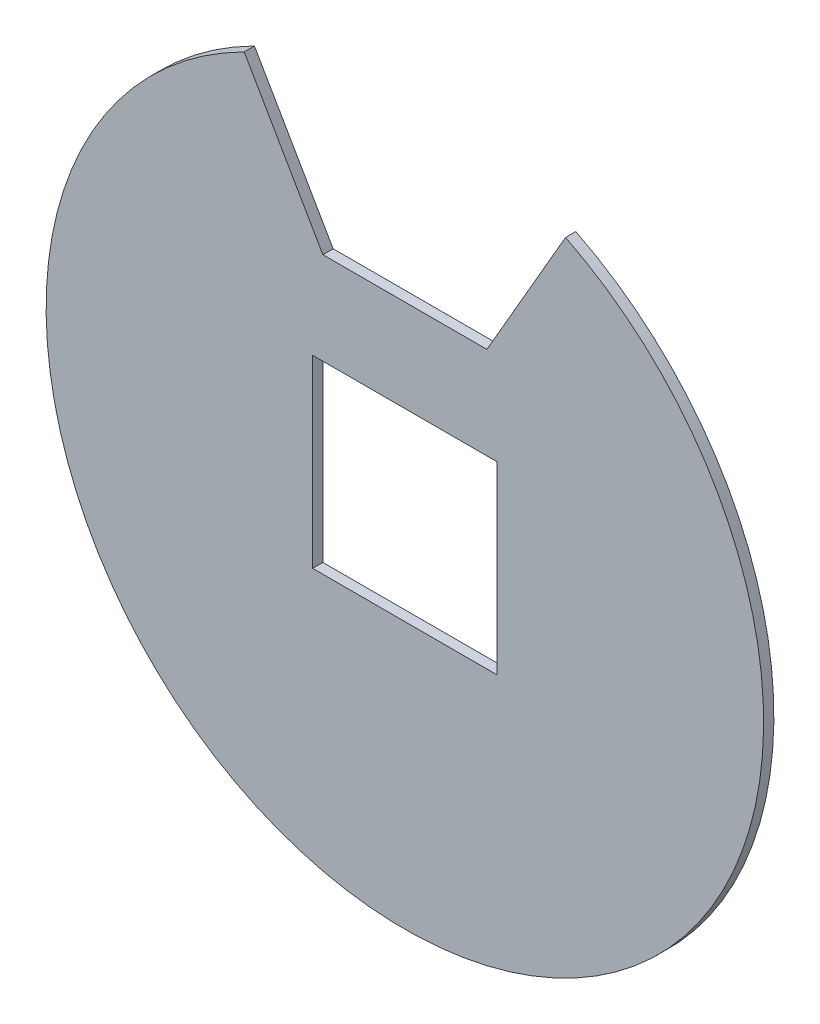
ISO-10303-21;
HEADER;
FILE_DESCRIPTION(('STEP AP214'),'2;1');
FILE_NAME('part.step','',(''),(''),'','','');
FILE_SCHEMA(('AUTOMOTIVE_DESIGN { 1 0 10303 214 1 1 1 1 }'));
ENDSEC;
DATA;
#1=APPLICATION_CONTEXT('core data for automotive mechanical design processes');
#2=APPLICATION_PROTOCOL_DEFINITION('international standard','automotive_design',2000,#1);
#3=PRODUCT_CONTEXT('',#1,'mechanical');
#4=PRODUCT('Part','Part','',(#3));
#5=PRODUCT_RELATED_PRODUCT_CATEGORY('part','',(#4));
#6=PRODUCT_DEFINITION_FORMATION('','',#4);
#7=PRODUCT_DEFINITION_CONTEXT('part definition',#1,'design');
#8=PRODUCT_DEFINITION('design','',#6,#7);
#9=PRODUCT_DEFINITION_SHAPE('','',#8);
#10=(LENGTH_UNIT() NAMED_UNIT(*) SI_UNIT(.MILLI.,.METRE.));
#11=(NAMED_UNIT(*) PLANE_ANGLE_UNIT() SI_UNIT($,.RADIAN.));
#12=(NAMED_UNIT(*) SI_UNIT($,.STERADIAN.) SOLID_ANGLE_UNIT());
#13=UNCERTAINTY_MEASURE_WITH_UNIT(LENGTH_MEASURE(1.E-05),#10,'distance_accuracy_value','');
#14=(GEOMETRIC_REPRESENTATION_CONTEXT(3) GLOBAL_UNCERTAINTY_ASSIGNED_CONTEXT((#13)) GLOBAL_UNIT_ASSIGNED_CONTEXT((#10,
#11,#12)) REPRESENTATION_CONTEXT('',''));
#15=CARTESIAN_POINT('',(0.,0.,0.));
#16=DIRECTION('',(0.,0.,1.));
#17=DIRECTION('',(1.,0.,0.));
#18=AXIS2_PLACEMENT_3D('',#15,#16,#17);
#19=CARTESIAN_POINT('',(0.,0.,5.));
#20=DIRECTION('',(0.,0.,1.));
#21=DIRECTION('',(1.,0.,0.));
#22=AXIS2_PLACEMENT_3D('',#19,#20,#21);
#23=PLANE('',#22);
#24=DIRECTION('',(0.499999999999998,0.86602540378444,0.));
#25=VECTOR('',#24,1.);
#26=CARTESIAN_POINT('',(78.3754243833597,156.468184793997,5.));
#27=LINE('',#26,#25);
#28=CARTESIAN_POINT('',(40.,89.9999999999997,5.));
#29=VERTEX_POINT('',#28);
#30=CARTESIAN_POINT('',(78.3754243833597,156.468184793997,5.));
#31=VERTEX_POINT('',#30);
#32=EDGE_CURVE('E156',#29,#31,#27,.T.);
#33=ORIENTED_EDGE('',*,*,#32,.F.);
#34=DIRECTION('',(1.,0.,0.));
#35=VECTOR('',#34,1.);
#36=CARTESIAN_POINT('',(40.,89.9999999999997,5.));
#37=LINE('',#36,#35);
#38=CARTESIAN_POINT('',(-40.,89.9999999999997,5.));
#39=VERTEX_POINT('',#38);
#40=EDGE_CURVE('E113',#39,#29,#37,.T.);
#41=ORIENTED_EDGE('',*,*,#40,.F.);
#42=DIRECTION('',(0.499999999999998,-0.86602540378444,0.));
#43=VECTOR('',#42,1.);
#44=CARTESIAN_POINT('',(-40.,89.9999999999997,5.));
#45=LINE('',#44,#43);
#46=CARTESIAN_POINT('',(-78.3754243833597,156.468184793997,5.));
#47=VERTEX_POINT('',#46);
#48=EDGE_CURVE('E100',#47,#39,#45,.T.);
#49=ORIENTED_EDGE('',*,*,#48,.F.);
#50=CARTESIAN_POINT('',(0.,0.,5.));
#51=DIRECTION('',(0.,0.,1.));
#52=DIRECTION('',(1.,0.,0.));
#53=AXIS2_PLACEMENT_3D('',#50,#51,#52);
#54=CIRCLE('',#53,175.);
#55=EDGE_CURVE('E106',#47,#31,#54,.T.);
#56=ORIENTED_EDGE('',*,*,#55,.T.);
#57=EDGE_LOOP('',(#33,#41,#49,#56));
#58=FACE_BOUND('',#57,.T.);
#59=DIRECTION('',(0.,-1.,0.));
#60=VECTOR('',#59,1.);
#61=CARTESIAN_POINT('',(-45.,-45.,5.));
#62=LINE('',#61,#60);
#63=CARTESIAN_POINT('',(-45.,45.,5.));
#64=VERTEX_POINT('',#63);
#65=CARTESIAN_POINT('',(-45.,-45.,5.));
#66=VERTEX_POINT('',#65);
#67=EDGE_CURVE('E147',#64,#66,#62,.T.);
#68=ORIENTED_EDGE('',*,*,#67,.F.);
#69=DIRECTION('',(-1.,0.,0.));
#70=VECTOR('',#69,1.);
#71=CARTESIAN_POINT('',(-45.,45.,5.));
#72=LINE('',#71,#70);
#73=CARTESIAN_POINT('',(45.,45.,5.));
#74=VERTEX_POINT('',#73);
#75=EDGE_CURVE('E133',#74,#64,#72,.T.);
#76=ORIENTED_EDGE('',*,*,#75,.F.);
#77=DIRECTION('',(0.,1.,0.));
#78=VECTOR('',#77,1.);
#79=CARTESIAN_POINT('',(45.,45.,5.));
#80=LINE('',#79,#78);
#81=CARTESIAN_POINT('',(45.,-45.,5.));
#82=VERTEX_POINT('',#81);
#83=EDGE_CURVE('E129',#82,#74,#80,.T.);
#84=ORIENTED_EDGE('',*,*,#83,.F.);
#85=DIRECTION('',(1.,0.,0.));
#86=VECTOR('',#85,1.);
#87=CARTESIAN_POINT('',(45.,-45.,5.));
#88=LINE('',#87,#86);
#89=EDGE_CURVE('E145',#66,#82,#88,.T.);
#90=ORIENTED_EDGE('',*,*,#89,.F.);
#91=EDGE_LOOP('',(#68,#76,#84,#90));
#92=FACE_BOUND('',#91,.T.);
#93=ADVANCED_FACE('F33',(#58,#92),#23,.T.);
#94=CARTESIAN_POINT('',(0.,0.,0.));
#95=DIRECTION('',(0.,0.,1.));
#96=DIRECTION('',(1.,0.,0.));
#97=AXIS2_PLACEMENT_3D('',#94,#95,#96);
#98=PLANE('',#97);
#99=DIRECTION('',(1.,0.,0.));
#100=VECTOR('',#99,1.);
#101=CARTESIAN_POINT('',(0.,89.9999999999997,0.));
#102=LINE('',#101,#100);
#103=CARTESIAN_POINT('',(-40.,89.9999999999997,0.));
#104=VERTEX_POINT('',#103);
#105=CARTESIAN_POINT('',(40.,89.9999999999997,0.));
#106=VERTEX_POINT('',#105);
#107=EDGE_CURVE('E11',#104,#106,#102,.T.);
#108=ORIENTED_EDGE('',*,*,#107,.T.);
#109=DIRECTION('',(0.499999999999998,0.86602540378444,0.));
#110=VECTOR('',#109,1.);
#111=CARTESIAN_POINT('',(-8.97114317029943,5.17949192431102,0.));
#112=LINE('',#111,#110);
#113=CARTESIAN_POINT('',(78.3754243833597,156.468184793997,0.));
#114=VERTEX_POINT('',#113);
#115=EDGE_CURVE('E143',#106,#114,#112,.T.);
#116=ORIENTED_EDGE('',*,*,#115,.T.);
#117=CARTESIAN_POINT('',(0.,0.,0.));
#118=DIRECTION('',(0.,0.,1.));
#119=DIRECTION('',(1.,0.,0.));
#120=AXIS2_PLACEMENT_3D('',#117,#118,#119);
#121=CIRCLE('',#120,175.);
#122=CARTESIAN_POINT('',(-78.3754243833597,156.468184793997,0.));
#123=VERTEX_POINT('',#122);
#124=EDGE_CURVE('E116',#123,#114,#121,.T.);
#125=ORIENTED_EDGE('',*,*,#124,.F.);
#126=DIRECTION('',(0.499999999999998,-0.86602540378444,0.));
#127=VECTOR('',#126,1.);
#128=CARTESIAN_POINT('',(8.97114317029943,5.17949192431101,0.));
#129=LINE('',#128,#127);
#130=EDGE_CURVE('E48',#123,#104,#129,.T.);
#131=ORIENTED_EDGE('',*,*,#130,.T.);
#132=EDGE_LOOP('',(#108,#116,#125,#131));
#133=FACE_BOUND('',#132,.T.);
#134=DIRECTION('',(-1.,0.,0.));
#135=VECTOR('',#134,1.);
#136=CARTESIAN_POINT('',(-45.,45.,0.));
#137=LINE('',#136,#135);
#138=CARTESIAN_POINT('',(45.,45.,0.));
#139=VERTEX_POINT('',#138);
#140=CARTESIAN_POINT('',(-45.,45.,0.));
#141=VERTEX_POINT('',#140);
#142=EDGE_CURVE('E140',#139,#141,#137,.T.);
#143=ORIENTED_EDGE('',*,*,#142,.T.);
#144=DIRECTION('',(0.,-1.,0.));
#145=VECTOR('',#144,1.);
#146=CARTESIAN_POINT('',(-45.,-45.,0.));
#147=LINE('',#146,#145);
#148=CARTESIAN_POINT('',(-45.,-45.,0.));
#149=VERTEX_POINT('',#148);
#150=EDGE_CURVE('E137',#141,#149,#147,.T.);
#151=ORIENTED_EDGE('',*,*,#150,.T.);
#152=DIRECTION('',(1.,0.,0.));
#153=VECTOR('',#152,1.);
#154=CARTESIAN_POINT('',(45.,-45.,0.));
#155=LINE('',#154,#153);
#156=CARTESIAN_POINT('',(45.,-45.,0.));
#157=VERTEX_POINT('',#156);
#158=EDGE_CURVE('E134',#149,#157,#155,.T.);
#159=ORIENTED_EDGE('',*,*,#158,.T.);
#160=DIRECTION('',(0.,1.,0.));
#161=VECTOR('',#160,1.);
#162=CARTESIAN_POINT('',(45.,45.,0.));
#163=LINE('',#162,#161);
#164=EDGE_CURVE('E130',#157,#139,#163,.T.);
#165=ORIENTED_EDGE('',*,*,#164,.T.);
#166=EDGE_LOOP('',(#143,#151,#159,#165));
#167=FACE_BOUND('',#166,.T.);
#168=ADVANCED_FACE('F165',(#133,#167),#98,.F.);
#169=CARTESIAN_POINT('',(0.,0.,5.));
#170=DIRECTION('',(0.,0.,-1.));
#171=DIRECTION('',(-1.,0.,0.));
#172=AXIS2_PLACEMENT_3D('',#169,#170,#171);
#173=CYLINDRICAL_SURFACE('',#172,175.);
#174=ORIENTED_EDGE('',*,*,#124,.T.);
#175=DIRECTION('',(0.,0.,-1.));
#176=VECTOR('',#175,1.);
#177=CARTESIAN_POINT('',(78.3754243833597,156.468184793997,5.));
#178=LINE('',#177,#176);
#179=EDGE_CURVE('E41',#114,#31,#178,.F.);
#180=ORIENTED_EDGE('',*,*,#179,.T.);
#181=ORIENTED_EDGE('',*,*,#55,.F.);
#182=DIRECTION('',(0.,0.,-1.));
#183=VECTOR('',#182,1.);
#184=CARTESIAN_POINT('',(-78.3754243833597,156.468184793997,5.));
#185=LINE('',#184,#183);
#186=EDGE_CURVE('E97',#47,#123,#185,.T.);
#187=ORIENTED_EDGE('',*,*,#186,.T.);
#188=EDGE_LOOP('',(#174,#180,#181,#187));
#189=FACE_BOUND('',#188,.T.);
#190=ADVANCED_FACE('F35',(#189),#173,.T.);
#191=CARTESIAN_POINT('',(-45.,45.,5.));
#192=DIRECTION('',(0.,-1.,0.));
#193=DIRECTION('',(0.,0.,-1.));
#194=AXIS2_PLACEMENT_3D('',#191,#192,#193);
#195=PLANE('',#194);
#196=ORIENTED_EDGE('',*,*,#142,.F.);
#197=DIRECTION('',(0.,0.,-1.));
#198=VECTOR('',#197,1.);
#199=CARTESIAN_POINT('',(45.,45.,5.));
#200=LINE('',#199,#198);
#201=EDGE_CURVE('E126',#74,#139,#200,.T.);
#202=ORIENTED_EDGE('',*,*,#201,.F.);
#203=ORIENTED_EDGE('',*,*,#75,.T.);
#204=DIRECTION('',(0.,0.,-1.));
#205=VECTOR('',#204,1.);
#206=CARTESIAN_POINT('',(-45.,45.,5.));
#207=LINE('',#206,#205);
#208=EDGE_CURVE('E118',#64,#141,#207,.T.);
#209=ORIENTED_EDGE('',*,*,#208,.T.);
#210=EDGE_LOOP('',(#196,#202,#203,#209));
#211=FACE_BOUND('',#210,.T.);
#212=ADVANCED_FACE('F170',(#211),#195,.T.);
#213=CARTESIAN_POINT('',(-45.,-45.,5.));
#214=DIRECTION('',(1.,0.,0.));
#215=DIRECTION('',(0.,1.,0.));
#216=AXIS2_PLACEMENT_3D('',#213,#214,#215);
#217=PLANE('',#216);
#218=ORIENTED_EDGE('',*,*,#150,.F.);
#219=ORIENTED_EDGE('',*,*,#208,.F.);
#220=ORIENTED_EDGE('',*,*,#67,.T.);
#221=DIRECTION('',(0.,0.,-1.));
#222=VECTOR('',#221,1.);
#223=CARTESIAN_POINT('',(-45.,-45.,5.));
#224=LINE('',#223,#222);
#225=EDGE_CURVE('E123',#66,#149,#224,.T.);
#226=ORIENTED_EDGE('',*,*,#225,.T.);
#227=EDGE_LOOP('',(#218,#219,#220,#226));
#228=FACE_BOUND('',#227,.T.);
#229=ADVANCED_FACE('F178',(#228),#217,.T.);
#230=CARTESIAN_POINT('',(45.,-45.,5.));
#231=DIRECTION('',(0.,1.,0.));
#232=DIRECTION('',(-1.,0.,0.));
#233=AXIS2_PLACEMENT_3D('',#230,#231,#232);
#234=PLANE('',#233);
#235=ORIENTED_EDGE('',*,*,#158,.F.);
#236=ORIENTED_EDGE('',*,*,#225,.F.);
#237=ORIENTED_EDGE('',*,*,#89,.T.);
#238=DIRECTION('',(0.,0.,-1.));
#239=VECTOR('',#238,1.);
#240=CARTESIAN_POINT('',(45.,-45.,5.));
#241=LINE('',#240,#239);
#242=EDGE_CURVE('E56',#82,#157,#241,.T.);
#243=ORIENTED_EDGE('',*,*,#242,.T.);
#244=EDGE_LOOP('',(#235,#236,#237,#243));
#245=FACE_BOUND('',#244,.T.);
#246=ADVANCED_FACE('F182',(#245),#234,.T.);
#247=CARTESIAN_POINT('',(45.,45.,5.));
#248=DIRECTION('',(-1.,0.,0.));
#249=DIRECTION('',(0.,-1.,0.));
#250=AXIS2_PLACEMENT_3D('',#247,#248,#249);
#251=PLANE('',#250);
#252=ORIENTED_EDGE('',*,*,#164,.F.);
#253=ORIENTED_EDGE('',*,*,#242,.F.);
#254=ORIENTED_EDGE('',*,*,#83,.T.);
#255=ORIENTED_EDGE('',*,*,#201,.T.);
#256=EDGE_LOOP('',(#252,#253,#254,#255));
#257=FACE_BOUND('',#256,.T.);
#258=ADVANCED_FACE('F173',(#257),#251,.T.);
#259=CARTESIAN_POINT('',(40.,89.9999999999997,-5.));
#260=DIRECTION('',(0.,-1.,0.));
#261=DIRECTION('',(0.,0.,-1.));
#262=AXIS2_PLACEMENT_3D('',#259,#260,#261);
#263=PLANE('',#262);
#264=DIRECTION('',(0.,0.,1.));
#265=VECTOR('',#264,1.);
#266=CARTESIAN_POINT('',(-40.,89.9999999999997,-5.));
#267=LINE('',#266,#265);
#268=EDGE_CURVE('E154',#104,#39,#267,.T.);
#269=ORIENTED_EDGE('',*,*,#268,.T.);
#270=ORIENTED_EDGE('',*,*,#40,.T.);
#271=DIRECTION('',(0.,0.,1.));
#272=VECTOR('',#271,1.);
#273=CARTESIAN_POINT('',(40.,89.9999999999997,-5.));
#274=LINE('',#273,#272);
#275=EDGE_CURVE('E153',#106,#29,#274,.T.);
#276=ORIENTED_EDGE('',*,*,#275,.F.);
#277=ORIENTED_EDGE('',*,*,#107,.F.);
#278=EDGE_LOOP('',(#269,#270,#276,#277));
#279=FACE_BOUND('',#278,.T.);
#280=ADVANCED_FACE('F161',(#279),#263,.F.);
#281=CARTESIAN_POINT('',(78.3754243833597,156.468184793997,-5.));
#282=DIRECTION('',(0.86602540378444,-0.499999999999998,0.));
#283=DIRECTION('',(0.499999999999998,0.86602540378444,0.));
#284=AXIS2_PLACEMENT_3D('',#281,#282,#283);
#285=PLANE('',#284);
#286=ORIENTED_EDGE('',*,*,#275,.T.);
#287=ORIENTED_EDGE('',*,*,#32,.T.);
#288=ORIENTED_EDGE('',*,*,#179,.F.);
#289=ORIENTED_EDGE('',*,*,#115,.F.);
#290=EDGE_LOOP('',(#286,#287,#288,#289));
#291=FACE_BOUND('',#290,.T.);
#292=ADVANCED_FACE('F163',(#291),#285,.F.);
#293=CARTESIAN_POINT('',(-40.,89.9999999999997,-5.));
#294=DIRECTION('',(-0.86602540378444,-0.499999999999998,0.));
#295=DIRECTION('',(0.499999999999998,-0.86602540378444,0.));
#296=AXIS2_PLACEMENT_3D('',#293,#294,#295);
#297=PLANE('',#296);
#298=ORIENTED_EDGE('',*,*,#186,.F.);
#299=ORIENTED_EDGE('',*,*,#48,.T.);
#300=ORIENTED_EDGE('',*,*,#268,.F.);
#301=ORIENTED_EDGE('',*,*,#130,.F.);
#302=EDGE_LOOP('',(#298,#299,#300,#301));
#303=FACE_BOUND('',#302,.T.);
#304=ADVANCED_FACE('F99',(#303),#297,.F.);
#305=CLOSED_SHELL('',(#93,#168,#190,#212,#229,#246,#258,#280,#292,#304));
#306=MANIFOLD_SOLID_BREP('B2',#305);
#307=ADVANCED_BREP_SHAPE_REPRESENTATION('',(#18,#306),#14);
#308=SHAPE_DEFINITION_REPRESENTATION(#9,#307);
ENDSEC;
END-ISO-10303-21;
